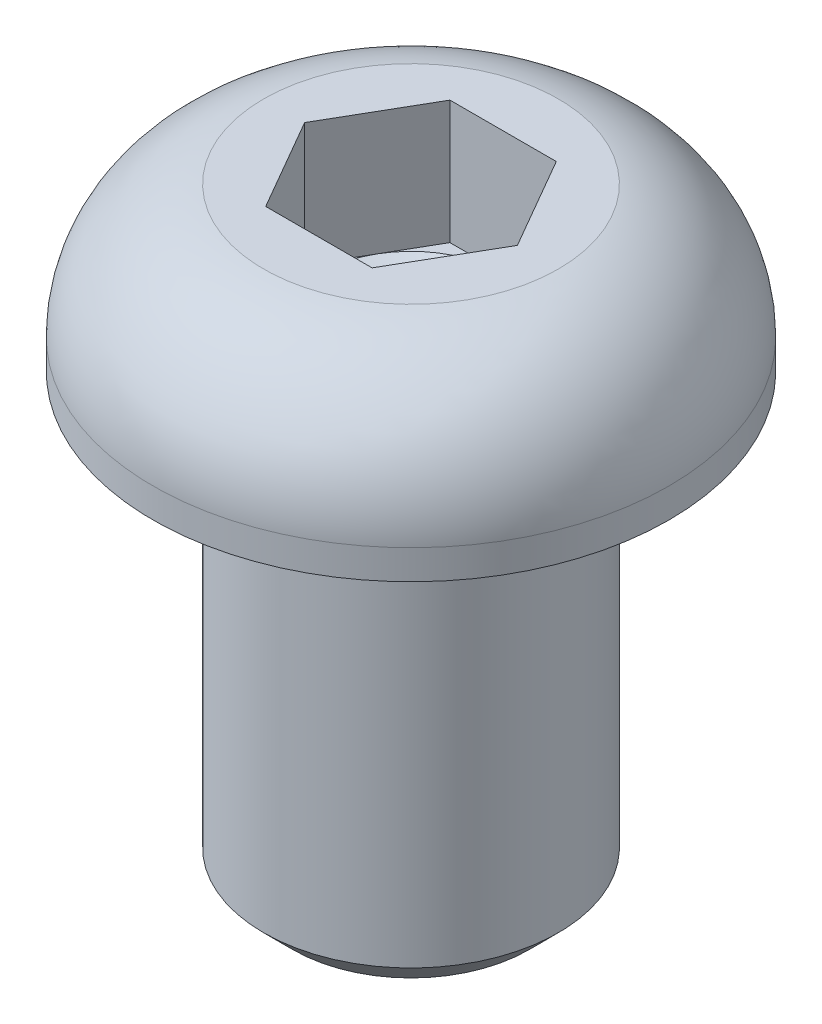
ISO-10303-21;
HEADER;
FILE_DESCRIPTION(('STEP AP214'),'2;1');
FILE_NAME('part.step','',(''),(''),'','','');
FILE_SCHEMA(('AUTOMOTIVE_DESIGN { 1 0 10303 214 1 1 1 1 }'));
ENDSEC;
DATA;
#1=APPLICATION_CONTEXT('core data for automotive mechanical design processes');
#2=APPLICATION_PROTOCOL_DEFINITION('international standard','automotive_design',2000,#1);
#3=PRODUCT_CONTEXT('',#1,'mechanical');
#4=PRODUCT('Part','Part','',(#3));
#5=PRODUCT_RELATED_PRODUCT_CATEGORY('part','',(#4));
#6=PRODUCT_DEFINITION_FORMATION('','',#4);
#7=PRODUCT_DEFINITION_CONTEXT('part definition',#1,'design');
#8=PRODUCT_DEFINITION('design','',#6,#7);
#9=PRODUCT_DEFINITION_SHAPE('','',#8);
#10=(LENGTH_UNIT() NAMED_UNIT(*) SI_UNIT(.MILLI.,.METRE.));
#11=(NAMED_UNIT(*) PLANE_ANGLE_UNIT() SI_UNIT($,.RADIAN.));
#12=(NAMED_UNIT(*) SI_UNIT($,.STERADIAN.) SOLID_ANGLE_UNIT());
#13=UNCERTAINTY_MEASURE_WITH_UNIT(LENGTH_MEASURE(1.E-05),#10,'distance_accuracy_value','');
#14=(GEOMETRIC_REPRESENTATION_CONTEXT(3) GLOBAL_UNCERTAINTY_ASSIGNED_CONTEXT((#13)) GLOBAL_UNIT_ASSIGNED_CONTEXT((#10,
#11,#12)) REPRESENTATION_CONTEXT('',''));
#15=CARTESIAN_POINT('',(0.,0.,0.));
#16=DIRECTION('',(0.,0.,1.));
#17=DIRECTION('',(1.,0.,0.));
#18=AXIS2_PLACEMENT_3D('',#15,#16,#17);
#19=CARTESIAN_POINT('',(1.44337567297406,1.05,-2.5));
#20=DIRECTION('',(0.,1.,0.));
#21=DIRECTION('',(1.,0.,0.));
#22=AXIS2_PLACEMENT_3D('',#19,#20,#21);
#23=PLANE('',#22);
#24=CARTESIAN_POINT('',(0.,1.05,0.));
#25=DIRECTION('',(0.,1.,0.));
#26=DIRECTION('',(0.,0.,1.));
#27=AXIS2_PLACEMENT_3D('',#24,#25,#26);
#28=CIRCLE('',#27,2.5);
#29=CARTESIAN_POINT('',(-2.1650635094611,1.05,1.25));
#30=VERTEX_POINT('',#29);
#31=CARTESIAN_POINT('',(0.,1.05,2.5));
#32=VERTEX_POINT('',#31);
#33=EDGE_CURVE('E190',#30,#32,#28,.T.);
#34=ORIENTED_EDGE('',*,*,#33,.F.);
#35=DIRECTION('',(0.5,0.,0.866025403784439));
#36=VECTOR('',#35,1.);
#37=CARTESIAN_POINT('',(-2.88675134594813,1.05,0.));
#38=LINE('',#37,#36);
#39=CARTESIAN_POINT('',(-1.44337567297406,1.05,2.5));
#40=VERTEX_POINT('',#39);
#41=EDGE_CURVE('E43',#30,#40,#38,.T.);
#42=ORIENTED_EDGE('',*,*,#41,.T.);
#43=DIRECTION('',(1.,0.,0.));
#44=VECTOR('',#43,1.);
#45=CARTESIAN_POINT('',(-1.44337567297406,1.05,2.5));
#46=LINE('',#45,#44);
#47=EDGE_CURVE('E170',#40,#32,#46,.T.);
#48=ORIENTED_EDGE('',*,*,#47,.T.);
#49=EDGE_LOOP('',(#34,#42,#48));
#50=FACE_BOUND('',#49,.T.);
#51=ADVANCED_FACE('F17',(#50),#23,.T.);
#52=CARTESIAN_POINT('',(1.44337567297406,1.05,-2.5));
#53=DIRECTION('',(0.,0.,-1.));
#54=DIRECTION('',(-1.,0.,0.));
#55=AXIS2_PLACEMENT_3D('',#52,#53,#54);
#56=PLANE('',#55);
#57=DIRECTION('',(-1.,0.,0.));
#58=VECTOR('',#57,1.);
#59=CARTESIAN_POINT('',(1.44337567297406,4.4,-2.5));
#60=LINE('',#59,#58);
#61=CARTESIAN_POINT('',(1.44337567297406,4.4,-2.5));
#62=VERTEX_POINT('',#61);
#63=CARTESIAN_POINT('',(-1.44337567297406,4.4,-2.5));
#64=VERTEX_POINT('',#63);
#65=EDGE_CURVE('E155',#62,#64,#60,.T.);
#66=ORIENTED_EDGE('',*,*,#65,.T.);
#67=DIRECTION('',(0.,1.,0.));
#68=VECTOR('',#67,1.);
#69=CARTESIAN_POINT('',(-1.44337567297406,1.05,-2.5));
#70=LINE('',#69,#68);
#71=CARTESIAN_POINT('',(-1.44337567297406,1.05,-2.5));
#72=VERTEX_POINT('',#71);
#73=EDGE_CURVE('E11',#72,#64,#70,.T.);
#74=ORIENTED_EDGE('',*,*,#73,.F.);
#75=DIRECTION('',(-1.,0.,0.));
#76=VECTOR('',#75,1.);
#77=CARTESIAN_POINT('',(1.44337567297406,1.05,-2.5));
#78=LINE('',#77,#76);
#79=CARTESIAN_POINT('',(0.,1.05,-2.5));
#80=VERTEX_POINT('',#79);
#81=EDGE_CURVE('E237',#80,#72,#78,.T.);
#82=ORIENTED_EDGE('',*,*,#81,.F.);
#83=DIRECTION('',(-1.,0.,0.));
#84=VECTOR('',#83,1.);
#85=CARTESIAN_POINT('',(1.44337567297406,1.05,-2.5));
#86=LINE('',#85,#84);
#87=CARTESIAN_POINT('',(1.44337567297406,1.05,-2.5));
#88=VERTEX_POINT('',#87);
#89=EDGE_CURVE('E217',#88,#80,#86,.T.);
#90=ORIENTED_EDGE('',*,*,#89,.F.);
#91=DIRECTION('',(0.,1.,0.));
#92=VECTOR('',#91,1.);
#93=CARTESIAN_POINT('',(1.44337567297406,1.05,-2.5));
#94=LINE('',#93,#92);
#95=EDGE_CURVE('E139',#88,#62,#94,.T.);
#96=ORIENTED_EDGE('',*,*,#95,.T.);
#97=EDGE_LOOP('',(#66,#74,#82,#90,#96));
#98=FACE_BOUND('',#97,.T.);
#99=ADVANCED_FACE('F326',(#98),#56,.F.);
#100=CARTESIAN_POINT('',(-1.44337567297406,1.05,-2.5));
#101=DIRECTION('',(-0.866025403784439,0.,-0.5));
#102=DIRECTION('',(-0.5,0.,0.866025403784439));
#103=AXIS2_PLACEMENT_3D('',#100,#101,#102);
#104=PLANE('',#103);
#105=DIRECTION('',(-0.5,0.,0.866025403784439));
#106=VECTOR('',#105,1.);
#107=CARTESIAN_POINT('',(-1.44337567297406,4.4,-2.5));
#108=LINE('',#107,#106);
#109=CARTESIAN_POINT('',(-2.88675134594813,4.4,0.));
#110=VERTEX_POINT('',#109);
#111=EDGE_CURVE('E185',#64,#110,#108,.T.);
#112=ORIENTED_EDGE('',*,*,#111,.T.);
#113=DIRECTION('',(0.,1.,0.));
#114=VECTOR('',#113,1.);
#115=CARTESIAN_POINT('',(-2.88675134594813,1.05,0.));
#116=LINE('',#115,#114);
#117=CARTESIAN_POINT('',(-2.88675134594813,1.05,0.));
#118=VERTEX_POINT('',#117);
#119=EDGE_CURVE('E28',#118,#110,#116,.T.);
#120=ORIENTED_EDGE('',*,*,#119,.F.);
#121=DIRECTION('',(-0.5,0.,0.866025403784439));
#122=VECTOR('',#121,1.);
#123=CARTESIAN_POINT('',(-1.44337567297406,1.05,-2.5));
#124=LINE('',#123,#122);
#125=CARTESIAN_POINT('',(-2.1650635094611,1.05,-1.25));
#126=VERTEX_POINT('',#125);
#127=EDGE_CURVE('E207',#126,#118,#124,.T.);
#128=ORIENTED_EDGE('',*,*,#127,.F.);
#129=DIRECTION('',(-0.5,0.,0.866025403784439));
#130=VECTOR('',#129,1.);
#131=CARTESIAN_POINT('',(-1.44337567297406,1.05,-2.5));
#132=LINE('',#131,#130);
#133=EDGE_CURVE('E256',#72,#126,#132,.T.);
#134=ORIENTED_EDGE('',*,*,#133,.F.);
#135=ORIENTED_EDGE('',*,*,#73,.T.);
#136=EDGE_LOOP('',(#112,#120,#128,#134,#135));
#137=FACE_BOUND('',#136,.T.);
#138=ADVANCED_FACE('F388',(#137),#104,.F.);
#139=CARTESIAN_POINT('',(-2.88675134594813,1.05,0.));
#140=DIRECTION('',(-0.866025403784439,0.,0.5));
#141=DIRECTION('',(0.,1.,0.));
#142=AXIS2_PLACEMENT_3D('',#139,#140,#141);
#143=PLANE('',#142);
#144=DIRECTION('',(0.5,0.,0.866025403784439));
#145=VECTOR('',#144,1.);
#146=CARTESIAN_POINT('',(-2.88675134594813,4.4,0.));
#147=LINE('',#146,#145);
#148=CARTESIAN_POINT('',(-1.44337567297406,4.4,2.5));
#149=VERTEX_POINT('',#148);
#150=EDGE_CURVE('E181',#110,#149,#147,.T.);
#151=ORIENTED_EDGE('',*,*,#150,.T.);
#152=DIRECTION('',(0.,1.,0.));
#153=VECTOR('',#152,1.);
#154=CARTESIAN_POINT('',(-1.44337567297406,1.05,2.5));
#155=LINE('',#154,#153);
#156=EDGE_CURVE('E167',#40,#149,#155,.T.);
#157=ORIENTED_EDGE('',*,*,#156,.F.);
#158=ORIENTED_EDGE('',*,*,#41,.F.);
#159=DIRECTION('',(0.5,0.,0.866025403784439));
#160=VECTOR('',#159,1.);
#161=CARTESIAN_POINT('',(-2.88675134594813,1.05,0.));
#162=LINE('',#161,#160);
#163=EDGE_CURVE('E162',#118,#30,#162,.T.);
#164=ORIENTED_EDGE('',*,*,#163,.F.);
#165=ORIENTED_EDGE('',*,*,#119,.T.);
#166=EDGE_LOOP('',(#151,#157,#158,#164,#165));
#167=FACE_BOUND('',#166,.T.);
#168=ADVANCED_FACE('F312',(#167),#143,.F.);
#169=CARTESIAN_POINT('',(-1.44337567297406,1.05,2.5));
#170=DIRECTION('',(0.,0.,1.));
#171=DIRECTION('',(1.,0.,0.));
#172=AXIS2_PLACEMENT_3D('',#169,#170,#171);
#173=PLANE('',#172);
#174=DIRECTION('',(1.,0.,0.));
#175=VECTOR('',#174,1.);
#176=CARTESIAN_POINT('',(-1.44337567297406,4.4,2.5));
#177=LINE('',#176,#175);
#178=CARTESIAN_POINT('',(1.44337567297406,4.4,2.5));
#179=VERTEX_POINT('',#178);
#180=EDGE_CURVE('E149',#149,#179,#177,.T.);
#181=ORIENTED_EDGE('',*,*,#180,.T.);
#182=DIRECTION('',(0.,1.,0.));
#183=VECTOR('',#182,1.);
#184=CARTESIAN_POINT('',(1.44337567297406,1.05,2.5));
#185=LINE('',#184,#183);
#186=CARTESIAN_POINT('',(1.44337567297406,1.05,2.5));
#187=VERTEX_POINT('',#186);
#188=EDGE_CURVE('E138',#187,#179,#185,.T.);
#189=ORIENTED_EDGE('',*,*,#188,.F.);
#190=DIRECTION('',(1.,0.,0.));
#191=VECTOR('',#190,1.);
#192=CARTESIAN_POINT('',(-1.44337567297406,1.05,2.5));
#193=LINE('',#192,#191);
#194=EDGE_CURVE('E200',#32,#187,#193,.T.);
#195=ORIENTED_EDGE('',*,*,#194,.F.);
#196=ORIENTED_EDGE('',*,*,#47,.F.);
#197=ORIENTED_EDGE('',*,*,#156,.T.);
#198=EDGE_LOOP('',(#181,#189,#195,#196,#197));
#199=FACE_BOUND('',#198,.T.);
#200=ADVANCED_FACE('F307',(#199),#173,.F.);
#201=CARTESIAN_POINT('',(1.44337567297406,1.05,2.5));
#202=DIRECTION('',(0.866025403784439,0.,0.5));
#203=DIRECTION('',(0.,-1.,0.));
#204=AXIS2_PLACEMENT_3D('',#201,#202,#203);
#205=PLANE('',#204);
#206=DIRECTION('',(0.5,0.,-0.866025403784439));
#207=VECTOR('',#206,1.);
#208=CARTESIAN_POINT('',(1.44337567297406,4.4,2.5));
#209=LINE('',#208,#207);
#210=CARTESIAN_POINT('',(2.88675134594813,4.4,0.));
#211=VERTEX_POINT('',#210);
#212=EDGE_CURVE('E142',#179,#211,#209,.T.);
#213=ORIENTED_EDGE('',*,*,#212,.T.);
#214=DIRECTION('',(0.,1.,0.));
#215=VECTOR('',#214,1.);
#216=CARTESIAN_POINT('',(2.88675134594813,1.05,0.));
#217=LINE('',#216,#215);
#218=CARTESIAN_POINT('',(2.88675134594813,1.05,0.));
#219=VERTEX_POINT('',#218);
#220=EDGE_CURVE('E126',#219,#211,#217,.T.);
#221=ORIENTED_EDGE('',*,*,#220,.F.);
#222=DIRECTION('',(0.5,0.,-0.866025403784439));
#223=VECTOR('',#222,1.);
#224=CARTESIAN_POINT('',(1.44337567297406,1.05,2.5));
#225=LINE('',#224,#223);
#226=CARTESIAN_POINT('',(2.1650635094611,1.05,1.25));
#227=VERTEX_POINT('',#226);
#228=EDGE_CURVE('E171',#227,#219,#225,.T.);
#229=ORIENTED_EDGE('',*,*,#228,.F.);
#230=DIRECTION('',(0.5,0.,-0.866025403784439));
#231=VECTOR('',#230,1.);
#232=CARTESIAN_POINT('',(1.44337567297406,1.05,2.5));
#233=LINE('',#232,#231);
#234=EDGE_CURVE('E174',#187,#227,#233,.T.);
#235=ORIENTED_EDGE('',*,*,#234,.F.);
#236=ORIENTED_EDGE('',*,*,#188,.T.);
#237=EDGE_LOOP('',(#213,#221,#229,#235,#236));
#238=FACE_BOUND('',#237,.T.);
#239=ADVANCED_FACE('F143',(#238),#205,.F.);
#240=CARTESIAN_POINT('',(2.88675134594813,1.05,0.));
#241=DIRECTION('',(0.866025403784439,0.,-0.5));
#242=DIRECTION('',(0.,-1.,0.));
#243=AXIS2_PLACEMENT_3D('',#240,#241,#242);
#244=PLANE('',#243);
#245=DIRECTION('',(-0.5,0.,-0.866025403784439));
#246=VECTOR('',#245,1.);
#247=CARTESIAN_POINT('',(2.88675134594813,4.4,0.));
#248=LINE('',#247,#246);
#249=EDGE_CURVE('E130',#211,#62,#248,.T.);
#250=ORIENTED_EDGE('',*,*,#249,.T.);
#251=ORIENTED_EDGE('',*,*,#95,.F.);
#252=DIRECTION('',(-0.5,0.,-0.866025403784439));
#253=VECTOR('',#252,1.);
#254=CARTESIAN_POINT('',(2.88675134594813,1.05,0.));
#255=LINE('',#254,#253);
#256=CARTESIAN_POINT('',(2.1650635094611,1.05,-1.25));
#257=VERTEX_POINT('',#256);
#258=EDGE_CURVE('E213',#257,#88,#255,.T.);
#259=ORIENTED_EDGE('',*,*,#258,.F.);
#260=DIRECTION('',(-0.5,0.,-0.866025403784439));
#261=VECTOR('',#260,1.);
#262=CARTESIAN_POINT('',(2.88675134594813,1.05,0.));
#263=LINE('',#262,#261);
#264=EDGE_CURVE('E134',#219,#257,#263,.T.);
#265=ORIENTED_EDGE('',*,*,#264,.F.);
#266=ORIENTED_EDGE('',*,*,#220,.T.);
#267=EDGE_LOOP('',(#250,#251,#259,#265,#266));
#268=FACE_BOUND('',#267,.T.);
#269=ADVANCED_FACE('F128',(#268),#244,.F.);
#270=CARTESIAN_POINT('',(0.,-12.,0.));
#271=DIRECTION('',(0.,1.,0.));
#272=DIRECTION('',(1.,0.,0.));
#273=AXIS2_PLACEMENT_3D('',#270,#271,#272);
#274=PLANE('',#273);
#275=CARTESIAN_POINT('',(0.,-12.,0.));
#276=DIRECTION('',(0.,-1.,0.));
#277=DIRECTION('',(0.,0.,1.));
#278=AXIS2_PLACEMENT_3D('',#275,#276,#277);
#279=CIRCLE('',#278,3.2);
#280=CARTESIAN_POINT('',(0.,-12.,3.2));
#281=VERTEX_POINT('',#280);
#282=EDGE_CURVE('E21',#281,#281,#279,.T.);
#283=ORIENTED_EDGE('',*,*,#282,.T.);
#284=EDGE_LOOP('',(#283));
#285=FACE_BOUND('',#284,.T.);
#286=ADVANCED_FACE('F411',(#285),#274,.F.);
#287=CARTESIAN_POINT('',(4.,4.4,0.));
#288=DIRECTION('',(0.,-1.,0.));
#289=DIRECTION('',(0.,0.,-1.));
#290=AXIS2_PLACEMENT_3D('',#287,#288,#289);
#291=PLANE('',#290);
#292=ORIENTED_EDGE('',*,*,#65,.F.);
#293=ORIENTED_EDGE('',*,*,#249,.F.);
#294=ORIENTED_EDGE('',*,*,#212,.F.);
#295=ORIENTED_EDGE('',*,*,#180,.F.);
#296=ORIENTED_EDGE('',*,*,#150,.F.);
#297=ORIENTED_EDGE('',*,*,#111,.F.);
#298=EDGE_LOOP('',(#292,#293,#294,#295,#296,#297));
#299=FACE_BOUND('',#298,.T.);
#300=CARTESIAN_POINT('',(0.,4.4,0.));
#301=DIRECTION('',(0.,1.,0.));
#302=DIRECTION('',(-1.,0.,0.));
#303=AXIS2_PLACEMENT_3D('',#300,#301,#302);
#304=CIRCLE('',#303,4.);
#305=CARTESIAN_POINT('',(-4.,4.4,0.));
#306=VERTEX_POINT('',#305);
#307=EDGE_CURVE('E220',#306,#306,#304,.T.);
#308=ORIENTED_EDGE('',*,*,#307,.T.);
#309=EDGE_LOOP('',(#308));
#310=FACE_BOUND('',#309,.T.);
#311=ADVANCED_FACE('F151',(#299,#310),#291,.F.);
#312=CARTESIAN_POINT('',(0.,0.,0.));
#313=DIRECTION('',(0.,1.,0.));
#314=DIRECTION('',(1.,0.,0.));
#315=AXIS2_PLACEMENT_3D('',#312,#313,#314);
#316=PLANE('',#315);
#317=CARTESIAN_POINT('',(0.,0.,0.));
#318=DIRECTION('',(0.,-1.,0.));
#319=DIRECTION('',(-1.,0.,0.));
#320=AXIS2_PLACEMENT_3D('',#317,#318,#319);
#321=CIRCLE('',#320,5.25);
#322=CARTESIAN_POINT('',(0.,0.,-5.25));
#323=VERTEX_POINT('',#322);
#324=EDGE_CURVE('E175',#323,#323,#321,.T.);
#325=ORIENTED_EDGE('',*,*,#324,.F.);
#326=EDGE_LOOP('',(#325));
#327=FACE_BOUND('',#326,.T.);
#328=CARTESIAN_POINT('',(0.,0.,0.));
#329=DIRECTION('',(0.,1.,0.));
#330=DIRECTION('',(-1.,0.,0.));
#331=AXIS2_PLACEMENT_3D('',#328,#329,#330);
#332=CIRCLE('',#331,7.);
#333=CARTESIAN_POINT('',(7.,0.,0.));
#334=VERTEX_POINT('',#333);
#335=EDGE_CURVE('E204',#334,#334,#332,.T.);
#336=ORIENTED_EDGE('',*,*,#335,.F.);
#337=EDGE_LOOP('',(#336));
#338=FACE_BOUND('',#337,.T.);
#339=ADVANCED_FACE('F340',(#327,#338),#316,.F.);
#340=CARTESIAN_POINT('',(1.44337567297406,1.05,-2.5));
#341=DIRECTION('',(0.,1.,0.));
#342=DIRECTION('',(1.,0.,0.));
#343=AXIS2_PLACEMENT_3D('',#340,#341,#342);
#344=PLANE('',#343);
#345=CARTESIAN_POINT('',(0.,1.05,0.));
#346=DIRECTION('',(0.,1.,0.));
#347=DIRECTION('',(0.,0.,1.));
#348=AXIS2_PLACEMENT_3D('',#345,#346,#347);
#349=CIRCLE('',#348,2.5);
#350=EDGE_CURVE('E194',#126,#30,#349,.T.);
#351=ORIENTED_EDGE('',*,*,#350,.F.);
#352=ORIENTED_EDGE('',*,*,#127,.T.);
#353=ORIENTED_EDGE('',*,*,#163,.T.);
#354=EDGE_LOOP('',(#351,#352,#353));
#355=FACE_BOUND('',#354,.T.);
#356=ADVANCED_FACE('F334',(#355),#344,.T.);
#357=CARTESIAN_POINT('',(1.44337567297406,1.05,-2.5));
#358=DIRECTION('',(0.,1.,0.));
#359=DIRECTION('',(1.,0.,0.));
#360=AXIS2_PLACEMENT_3D('',#357,#358,#359);
#361=PLANE('',#360);
#362=CARTESIAN_POINT('',(0.,1.05,0.));
#363=DIRECTION('',(0.,1.,0.));
#364=DIRECTION('',(0.,0.,1.));
#365=AXIS2_PLACEMENT_3D('',#362,#363,#364);
#366=CIRCLE('',#365,2.5);
#367=EDGE_CURVE('E212',#80,#126,#366,.T.);
#368=ORIENTED_EDGE('',*,*,#367,.F.);
#369=ORIENTED_EDGE('',*,*,#81,.T.);
#370=ORIENTED_EDGE('',*,*,#133,.T.);
#371=EDGE_LOOP('',(#368,#369,#370));
#372=FACE_BOUND('',#371,.T.);
#373=ADVANCED_FACE('F339',(#372),#361,.T.);
#374=CARTESIAN_POINT('',(1.44337567297406,1.05,-2.5));
#375=DIRECTION('',(0.,1.,0.));
#376=DIRECTION('',(1.,0.,0.));
#377=AXIS2_PLACEMENT_3D('',#374,#375,#376);
#378=PLANE('',#377);
#379=CARTESIAN_POINT('',(0.,1.05,0.));
#380=DIRECTION('',(0.,1.,0.));
#381=DIRECTION('',(0.,0.,1.));
#382=AXIS2_PLACEMENT_3D('',#379,#380,#381);
#383=CIRCLE('',#382,2.5);
#384=EDGE_CURVE('E188',#257,#80,#383,.T.);
#385=ORIENTED_EDGE('',*,*,#384,.F.);
#386=ORIENTED_EDGE('',*,*,#258,.T.);
#387=ORIENTED_EDGE('',*,*,#89,.T.);
#388=EDGE_LOOP('',(#385,#386,#387));
#389=FACE_BOUND('',#388,.T.);
#390=ADVANCED_FACE('F360',(#389),#378,.T.);
#391=CARTESIAN_POINT('',(1.44337567297406,1.05,-2.5));
#392=DIRECTION('',(0.,1.,0.));
#393=DIRECTION('',(1.,0.,0.));
#394=AXIS2_PLACEMENT_3D('',#391,#392,#393);
#395=PLANE('',#394);
#396=CARTESIAN_POINT('',(0.,1.05,0.));
#397=DIRECTION('',(0.,1.,0.));
#398=DIRECTION('',(0.,0.,1.));
#399=AXIS2_PLACEMENT_3D('',#396,#397,#398);
#400=CIRCLE('',#399,2.5);
#401=EDGE_CURVE('E196',#227,#257,#400,.T.);
#402=ORIENTED_EDGE('',*,*,#401,.F.);
#403=ORIENTED_EDGE('',*,*,#228,.T.);
#404=ORIENTED_EDGE('',*,*,#264,.T.);
#405=EDGE_LOOP('',(#402,#403,#404));
#406=FACE_BOUND('',#405,.T.);
#407=ADVANCED_FACE('F365',(#406),#395,.T.);
#408=CARTESIAN_POINT('',(1.44337567297406,1.05,-2.5));
#409=DIRECTION('',(0.,1.,0.));
#410=DIRECTION('',(1.,0.,0.));
#411=AXIS2_PLACEMENT_3D('',#408,#409,#410);
#412=PLANE('',#411);
#413=CARTESIAN_POINT('',(0.,1.05,0.));
#414=DIRECTION('',(0.,1.,0.));
#415=DIRECTION('',(0.,0.,1.));
#416=AXIS2_PLACEMENT_3D('',#413,#414,#415);
#417=CIRCLE('',#416,2.5);
#418=EDGE_CURVE('E193',#32,#227,#417,.T.);
#419=ORIENTED_EDGE('',*,*,#418,.F.);
#420=ORIENTED_EDGE('',*,*,#194,.T.);
#421=ORIENTED_EDGE('',*,*,#234,.T.);
#422=EDGE_LOOP('',(#419,#420,#421));
#423=FACE_BOUND('',#422,.T.);
#424=ADVANCED_FACE('F453',(#423),#412,.T.);
#425=CARTESIAN_POINT('',(0.,4.4,0.));
#426=DIRECTION('',(0.,1.,0.));
#427=DIRECTION('',(-1.,0.,0.));
#428=AXIS2_PLACEMENT_3D('',#425,#426,#427);
#429=CYLINDRICAL_SURFACE('',#428,7.);
#430=CARTESIAN_POINT('',(0.,0.8,0.));
#431=DIRECTION('',(0.,1.,0.));
#432=DIRECTION('',(-1.,0.,0.));
#433=AXIS2_PLACEMENT_3D('',#430,#431,#432);
#434=CIRCLE('',#433,7.);
#435=CARTESIAN_POINT('',(7.,0.8,0.));
#436=VERTEX_POINT('',#435);
#437=EDGE_CURVE('E179',#436,#436,#434,.T.);
#438=ORIENTED_EDGE('',*,*,#437,.F.);
#439=EDGE_LOOP('',(#438));
#440=FACE_BOUND('',#439,.T.);
#441=ORIENTED_EDGE('',*,*,#335,.T.);
#442=EDGE_LOOP('',(#441));
#443=FACE_BOUND('',#442,.T.);
#444=ADVANCED_FACE('F296',(#440,#443),#429,.T.);
#445=CARTESIAN_POINT('',(0.,0.8,0.));
#446=DIRECTION('',(0.,1.,0.));
#447=DIRECTION('',(-1.,0.,0.));
#448=AXIS2_PLACEMENT_3D('',#445,#446,#447);
#449=DEGENERATE_TOROIDAL_SURFACE('',#448,3.34,3.66,.T.);
#450=ORIENTED_EDGE('',*,*,#307,.F.);
#451=EDGE_LOOP('',(#450));
#452=FACE_BOUND('',#451,.T.);
#453=ORIENTED_EDGE('',*,*,#437,.T.);
#454=EDGE_LOOP('',(#453));
#455=FACE_BOUND('',#454,.T.);
#456=ADVANCED_FACE('F291',(#452,#455),#449,.T.);
#457=CARTESIAN_POINT('',(0.,0.,0.));
#458=DIRECTION('',(0.,-1.,0.));
#459=DIRECTION('',(0.,0.,-1.));
#460=AXIS2_PLACEMENT_3D('',#457,#458,#459);
#461=TOROIDAL_SURFACE('',#460,4.625,0.625);
#462=ORIENTED_EDGE('',*,*,#324,.T.);
#463=EDGE_LOOP('',(#462));
#464=FACE_BOUND('',#463,.T.);
#465=CARTESIAN_POINT('',(0.,0.,0.));
#466=DIRECTION('',(0.,1.,0.));
#467=DIRECTION('',(1.,0.,0.));
#468=AXIS2_PLACEMENT_3D('',#465,#466,#467);
#469=CIRCLE('',#468,4.);
#470=CARTESIAN_POINT('',(0.,0.,4.));
#471=VERTEX_POINT('',#470);
#472=EDGE_CURVE('E180',#471,#471,#469,.T.);
#473=ORIENTED_EDGE('',*,*,#472,.T.);
#474=EDGE_LOOP('',(#473));
#475=FACE_BOUND('',#474,.T.);
#476=ADVANCED_FACE('F270',(#464,#475),#461,.F.);
#477=CARTESIAN_POINT('',(0.,-12.,0.));
#478=DIRECTION('',(0.,1.,0.));
#479=DIRECTION('',(0.,0.,1.));
#480=AXIS2_PLACEMENT_3D('',#477,#478,#479);
#481=CYLINDRICAL_SURFACE('',#480,4.);
#482=ORIENTED_EDGE('',*,*,#472,.F.);
#483=EDGE_LOOP('',(#482));
#484=FACE_BOUND('',#483,.T.);
#485=CARTESIAN_POINT('',(0.,-11.2,0.));
#486=DIRECTION('',(0.,1.,0.));
#487=DIRECTION('',(0.,0.,1.));
#488=AXIS2_PLACEMENT_3D('',#485,#486,#487);
#489=CIRCLE('',#488,4.);
#490=CARTESIAN_POINT('',(0.,-11.2,4.));
#491=VERTEX_POINT('',#490);
#492=EDGE_CURVE('E186',#491,#491,#489,.T.);
#493=ORIENTED_EDGE('',*,*,#492,.T.);
#494=EDGE_LOOP('',(#493));
#495=FACE_BOUND('',#494,.T.);
#496=ADVANCED_FACE('F19',(#484,#495),#481,.T.);
#497=CARTESIAN_POINT('',(0.,1.05,0.));
#498=DIRECTION('',(0.,1.,0.));
#499=DIRECTION('',(0.,0.,1.));
#500=AXIS2_PLACEMENT_3D('',#497,#498,#499);
#501=CONICAL_SURFACE('',#500,2.5,1.0471975511966);
#502=CARTESIAN_POINT('',(0.,-0.393375672974056,0.));
#503=VERTEX_POINT('',#502);
#504=VERTEX_LOOP('',#503);
#505=FACE_BOUND('',#504,.T.);
#506=ORIENTED_EDGE('',*,*,#384,.T.);
#507=ORIENTED_EDGE('',*,*,#367,.T.);
#508=ORIENTED_EDGE('',*,*,#350,.T.);
#509=ORIENTED_EDGE('',*,*,#33,.T.);
#510=ORIENTED_EDGE('',*,*,#418,.T.);
#511=ORIENTED_EDGE('',*,*,#401,.T.);
#512=EDGE_LOOP('',(#506,#507,#508,#509,#510,#511));
#513=FACE_BOUND('',#512,.T.);
#514=ADVANCED_FACE('F274',(#505,#513),#501,.F.);
#515=CARTESIAN_POINT('',(0.,-11.2,0.));
#516=DIRECTION('',(0.,1.,0.));
#517=DIRECTION('',(0.,0.,1.));
#518=AXIS2_PLACEMENT_3D('',#515,#516,#517);
#519=CONICAL_SURFACE('',#518,4.,0.78539816339745);
#520=ORIENTED_EDGE('',*,*,#492,.F.);
#521=EDGE_LOOP('',(#520));
#522=FACE_BOUND('',#521,.T.);
#523=ORIENTED_EDGE('',*,*,#282,.F.);
#524=EDGE_LOOP('',(#523));
#525=FACE_BOUND('',#524,.T.);
#526=ADVANCED_FACE('F277',(#522,#525),#519,.T.);
#527=CLOSED_SHELL('',(#51,#99,#138,#168,#200,#239,#269,#286,#311,#339,#356,#373,#390,#407,#424,
#444,#456,#476,#496,#514,#526));
#528=MANIFOLD_SOLID_BREP('B1',#527);
#529=ADVANCED_BREP_SHAPE_REPRESENTATION('',(#18,#528),#14);
#530=SHAPE_DEFINITION_REPRESENTATION(#9,#529);
ENDSEC;
END-ISO-10303-21;
